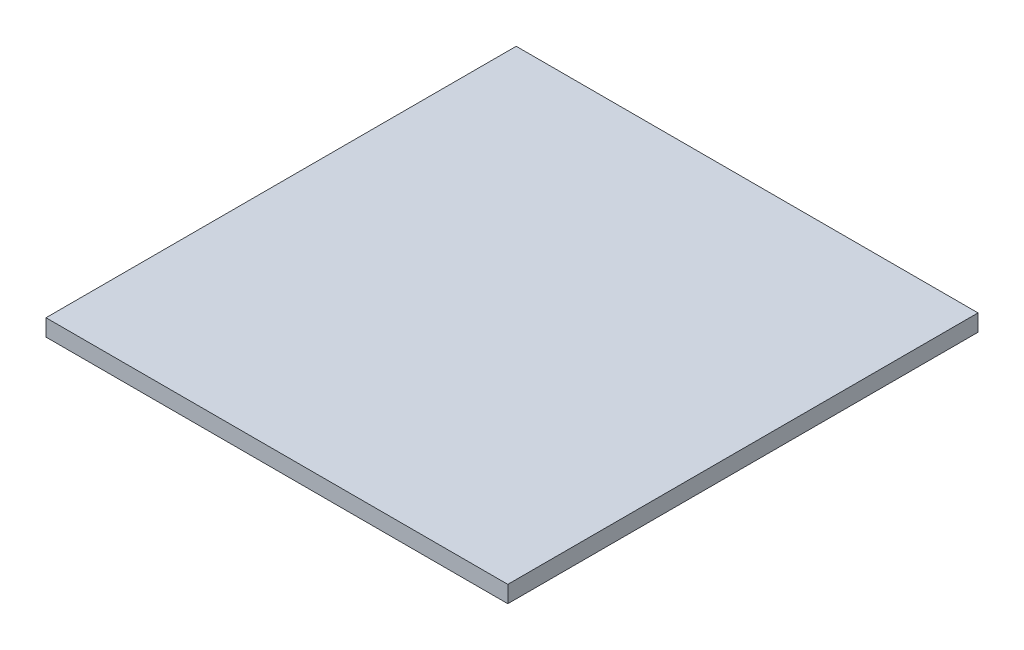
ISO-10303-21;
HEADER;
FILE_DESCRIPTION(('STEP AP214'),'2;1');
FILE_NAME('part.step','',(''),(''),'','','');
FILE_SCHEMA(('AUTOMOTIVE_DESIGN { 1 0 10303 214 1 1 1 1 }'));
ENDSEC;
DATA;
#1=APPLICATION_CONTEXT('core data for automotive mechanical design processes');
#2=APPLICATION_PROTOCOL_DEFINITION('international standard','automotive_design',2000,#1);
#3=PRODUCT_CONTEXT('',#1,'mechanical');
#4=PRODUCT('Part','Part','',(#3));
#5=PRODUCT_RELATED_PRODUCT_CATEGORY('part','',(#4));
#6=PRODUCT_DEFINITION_FORMATION('','',#4);
#7=PRODUCT_DEFINITION_CONTEXT('part definition',#1,'design');
#8=PRODUCT_DEFINITION('design','',#6,#7);
#9=PRODUCT_DEFINITION_SHAPE('','',#8);
#10=(LENGTH_UNIT() NAMED_UNIT(*) SI_UNIT(.MILLI.,.METRE.));
#11=(NAMED_UNIT(*) PLANE_ANGLE_UNIT() SI_UNIT($,.RADIAN.));
#12=(NAMED_UNIT(*) SI_UNIT($,.STERADIAN.) SOLID_ANGLE_UNIT());
#13=UNCERTAINTY_MEASURE_WITH_UNIT(LENGTH_MEASURE(1.E-05),#10,'distance_accuracy_value','');
#14=(GEOMETRIC_REPRESENTATION_CONTEXT(3) GLOBAL_UNCERTAINTY_ASSIGNED_CONTEXT((#13)) GLOBAL_UNIT_ASSIGNED_CONTEXT((#10,
#11,#12)) REPRESENTATION_CONTEXT('',''));
#15=CARTESIAN_POINT('',(0.,0.,0.));
#16=DIRECTION('',(0.,0.,1.));
#17=DIRECTION('',(1.,0.,0.));
#18=AXIS2_PLACEMENT_3D('',#15,#16,#17);
#19=CARTESIAN_POINT('',(275.,10.,0.));
#20=DIRECTION('',(0.,0.,-1.));
#21=DIRECTION('',(-1.,0.,0.));
#22=AXIS2_PLACEMENT_3D('',#19,#20,#21);
#23=PLANE('',#22);
#24=DIRECTION('',(0.,-1.,0.));
#25=VECTOR('',#24,1.);
#26=CARTESIAN_POINT('',(0.,10.,0.));
#27=LINE('',#26,#25);
#28=CARTESIAN_POINT('',(0.,10.,0.));
#29=VERTEX_POINT('',#28);
#30=CARTESIAN_POINT('',(0.,0.,0.));
#31=VERTEX_POINT('',#30);
#32=EDGE_CURVE('E108',#29,#31,#27,.T.);
#33=ORIENTED_EDGE('',*,*,#32,.T.);
#34=DIRECTION('',(-1.,0.,0.));
#35=VECTOR('',#34,1.);
#36=CARTESIAN_POINT('',(275.,0.,0.));
#37=LINE('',#36,#35);
#38=CARTESIAN_POINT('',(275.,0.,0.));
#39=VERTEX_POINT('',#38);
#40=EDGE_CURVE('E11',#39,#31,#37,.T.);
#41=ORIENTED_EDGE('',*,*,#40,.F.);
#42=DIRECTION('',(0.,-1.,0.));
#43=VECTOR('',#42,1.);
#44=CARTESIAN_POINT('',(275.,10.,0.));
#45=LINE('',#44,#43);
#46=CARTESIAN_POINT('',(275.,10.,0.));
#47=VERTEX_POINT('',#46);
#48=EDGE_CURVE('E96',#47,#39,#45,.T.);
#49=ORIENTED_EDGE('',*,*,#48,.F.);
#50=DIRECTION('',(-1.,0.,0.));
#51=VECTOR('',#50,1.);
#52=CARTESIAN_POINT('',(275.,10.,0.));
#53=LINE('',#52,#51);
#54=EDGE_CURVE('E104',#47,#29,#53,.T.);
#55=ORIENTED_EDGE('',*,*,#54,.T.);
#56=EDGE_LOOP('',(#33,#41,#49,#55));
#57=FACE_BOUND('',#56,.T.);
#58=ADVANCED_FACE('F45',(#57),#23,.F.);
#59=CARTESIAN_POINT('',(275.,0.,0.));
#60=DIRECTION('',(0.,1.,0.));
#61=DIRECTION('',(0.,0.,1.));
#62=AXIS2_PLACEMENT_3D('',#59,#60,#61);
#63=PLANE('',#62);
#64=DIRECTION('',(0.,0.,-1.));
#65=VECTOR('',#64,1.);
#66=CARTESIAN_POINT('',(0.,0.,0.));
#67=LINE('',#66,#65);
#68=CARTESIAN_POINT('',(0.,0.,-280.));
#69=VERTEX_POINT('',#68);
#70=EDGE_CURVE('E100',#31,#69,#67,.T.);
#71=ORIENTED_EDGE('',*,*,#70,.T.);
#72=DIRECTION('',(-1.,0.,0.));
#73=VECTOR('',#72,1.);
#74=CARTESIAN_POINT('',(275.,0.,-280.));
#75=LINE('',#74,#73);
#76=CARTESIAN_POINT('',(275.,0.,-280.));
#77=VERTEX_POINT('',#76);
#78=EDGE_CURVE('E53',#77,#69,#75,.T.);
#79=ORIENTED_EDGE('',*,*,#78,.F.);
#80=DIRECTION('',(0.,0.,-1.));
#81=VECTOR('',#80,1.);
#82=CARTESIAN_POINT('',(275.,0.,0.));
#83=LINE('',#82,#81);
#84=EDGE_CURVE('E91',#39,#77,#83,.T.);
#85=ORIENTED_EDGE('',*,*,#84,.F.);
#86=ORIENTED_EDGE('',*,*,#40,.T.);
#87=EDGE_LOOP('',(#71,#79,#85,#86));
#88=FACE_BOUND('',#87,.T.);
#89=ADVANCED_FACE('F99',(#88),#63,.F.);
#90=CARTESIAN_POINT('',(275.,10.,-280.));
#91=DIRECTION('',(0.,0.,1.));
#92=DIRECTION('',(1.,0.,0.));
#93=AXIS2_PLACEMENT_3D('',#90,#91,#92);
#94=PLANE('',#93);
#95=DIRECTION('',(0.,1.,0.));
#96=VECTOR('',#95,1.);
#97=CARTESIAN_POINT('',(0.,10.,-280.));
#98=LINE('',#97,#96);
#99=CARTESIAN_POINT('',(0.,10.,-280.));
#100=VERTEX_POINT('',#99);
#101=EDGE_CURVE('E78',#69,#100,#98,.T.);
#102=ORIENTED_EDGE('',*,*,#101,.T.);
#103=DIRECTION('',(-1.,0.,0.));
#104=VECTOR('',#103,1.);
#105=CARTESIAN_POINT('',(275.,10.,-280.));
#106=LINE('',#105,#104);
#107=CARTESIAN_POINT('',(275.,10.,-280.));
#108=VERTEX_POINT('',#107);
#109=EDGE_CURVE('E101',#108,#100,#106,.T.);
#110=ORIENTED_EDGE('',*,*,#109,.F.);
#111=DIRECTION('',(0.,1.,0.));
#112=VECTOR('',#111,1.);
#113=CARTESIAN_POINT('',(275.,10.,-280.));
#114=LINE('',#113,#112);
#115=EDGE_CURVE('E94',#77,#108,#114,.T.);
#116=ORIENTED_EDGE('',*,*,#115,.F.);
#117=ORIENTED_EDGE('',*,*,#78,.T.);
#118=EDGE_LOOP('',(#102,#110,#116,#117));
#119=FACE_BOUND('',#118,.T.);
#120=ADVANCED_FACE('F102',(#119),#94,.F.);
#121=CARTESIAN_POINT('',(275.,10.,0.));
#122=DIRECTION('',(0.,-1.,0.));
#123=DIRECTION('',(0.,0.,-1.));
#124=AXIS2_PLACEMENT_3D('',#121,#122,#123);
#125=PLANE('',#124);
#126=DIRECTION('',(0.,0.,1.));
#127=VECTOR('',#126,1.);
#128=CARTESIAN_POINT('',(0.,10.,0.));
#129=LINE('',#128,#127);
#130=EDGE_CURVE('E84',#100,#29,#129,.T.);
#131=ORIENTED_EDGE('',*,*,#130,.T.);
#132=ORIENTED_EDGE('',*,*,#54,.F.);
#133=DIRECTION('',(0.,0.,1.));
#134=VECTOR('',#133,1.);
#135=CARTESIAN_POINT('',(275.,10.,0.));
#136=LINE('',#135,#134);
#137=EDGE_CURVE('E61',#108,#47,#136,.T.);
#138=ORIENTED_EDGE('',*,*,#137,.F.);
#139=ORIENTED_EDGE('',*,*,#109,.T.);
#140=EDGE_LOOP('',(#131,#132,#138,#139));
#141=FACE_BOUND('',#140,.T.);
#142=ADVANCED_FACE('F115',(#141),#125,.F.);
#143=CARTESIAN_POINT('',(275.,0.,0.));
#144=DIRECTION('',(1.,0.,0.));
#145=DIRECTION('',(0.,0.,-1.));
#146=AXIS2_PLACEMENT_3D('',#143,#144,#145);
#147=PLANE('',#146);
#148=ORIENTED_EDGE('',*,*,#48,.T.);
#149=ORIENTED_EDGE('',*,*,#84,.T.);
#150=ORIENTED_EDGE('',*,*,#115,.T.);
#151=ORIENTED_EDGE('',*,*,#137,.T.);
#152=EDGE_LOOP('',(#148,#149,#150,#151));
#153=FACE_BOUND('',#152,.T.);
#154=ADVANCED_FACE('F92',(#153),#147,.T.);
#155=CARTESIAN_POINT('',(0.,0.,0.));
#156=DIRECTION('',(1.,0.,0.));
#157=DIRECTION('',(0.,0.,-1.));
#158=AXIS2_PLACEMENT_3D('',#155,#156,#157);
#159=PLANE('',#158);
#160=ORIENTED_EDGE('',*,*,#32,.F.);
#161=ORIENTED_EDGE('',*,*,#130,.F.);
#162=ORIENTED_EDGE('',*,*,#101,.F.);
#163=ORIENTED_EDGE('',*,*,#70,.F.);
#164=EDGE_LOOP('',(#160,#161,#162,#163));
#165=FACE_BOUND('',#164,.T.);
#166=ADVANCED_FACE('F118',(#165),#159,.F.);
#167=CLOSED_SHELL('',(#58,#89,#120,#142,#154,#166));
#168=MANIFOLD_SOLID_BREP('B2',#167);
#169=ADVANCED_BREP_SHAPE_REPRESENTATION('',(#18,#168),#14);
#170=SHAPE_DEFINITION_REPRESENTATION(#9,#169);
ENDSEC;
END-ISO-10303-21;
